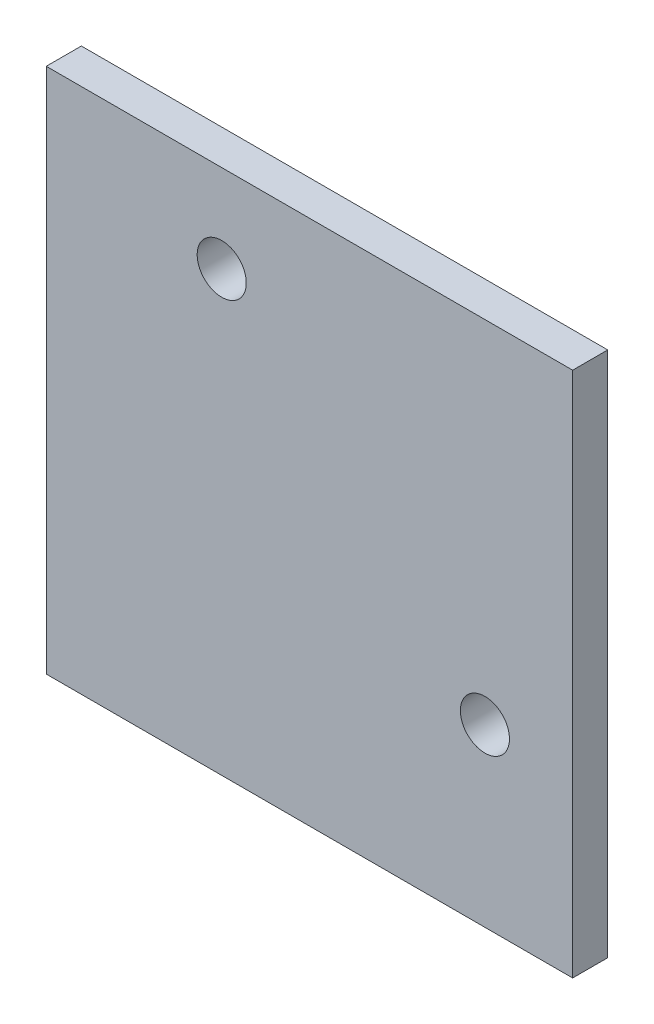
ISO-10303-21;
HEADER;
FILE_DESCRIPTION(('STEP AP214'),'2;1');
FILE_NAME('part.step','',(''),(''),'','','');
FILE_SCHEMA(('AUTOMOTIVE_DESIGN { 1 0 10303 214 1 1 1 1 }'));
ENDSEC;
DATA;
#1=APPLICATION_CONTEXT('core data for automotive mechanical design processes');
#2=APPLICATION_PROTOCOL_DEFINITION('international standard','automotive_design',2000,#1);
#3=PRODUCT_CONTEXT('',#1,'mechanical');
#4=PRODUCT('Part','Part','',(#3));
#5=PRODUCT_RELATED_PRODUCT_CATEGORY('part','',(#4));
#6=PRODUCT_DEFINITION_FORMATION('','',#4);
#7=PRODUCT_DEFINITION_CONTEXT('part definition',#1,'design');
#8=PRODUCT_DEFINITION('design','',#6,#7);
#9=PRODUCT_DEFINITION_SHAPE('','',#8);
#10=(LENGTH_UNIT() NAMED_UNIT(*) SI_UNIT(.MILLI.,.METRE.));
#11=(NAMED_UNIT(*) PLANE_ANGLE_UNIT() SI_UNIT($,.RADIAN.));
#12=(NAMED_UNIT(*) SI_UNIT($,.STERADIAN.) SOLID_ANGLE_UNIT());
#13=UNCERTAINTY_MEASURE_WITH_UNIT(LENGTH_MEASURE(1.E-05),#10,'distance_accuracy_value','');
#14=(GEOMETRIC_REPRESENTATION_CONTEXT(3) GLOBAL_UNCERTAINTY_ASSIGNED_CONTEXT((#13)) GLOBAL_UNIT_ASSIGNED_CONTEXT((#10,
#11,#12)) REPRESENTATION_CONTEXT('',''));
#15=CARTESIAN_POINT('',(0.,0.,0.));
#16=DIRECTION('',(0.,0.,1.));
#17=DIRECTION('',(1.,0.,0.));
#18=AXIS2_PLACEMENT_3D('',#15,#16,#17);
#19=CARTESIAN_POINT('',(0.,0.,-10.));
#20=DIRECTION('',(-1.,0.,0.));
#21=DIRECTION('',(0.,0.,1.));
#22=AXIS2_PLACEMENT_3D('',#19,#20,#21);
#23=PLANE('',#22);
#24=DIRECTION('',(0.,-1.,0.));
#25=VECTOR('',#24,1.);
#26=CARTESIAN_POINT('',(0.,0.,0.));
#27=LINE('',#26,#25);
#28=CARTESIAN_POINT('',(0.,0.,0.));
#29=VERTEX_POINT('',#28);
#30=CARTESIAN_POINT('',(0.,-150.,2.22044604925031E-13));
#31=VERTEX_POINT('',#30);
#32=EDGE_CURVE('E104',#29,#31,#27,.T.);
#33=ORIENTED_EDGE('',*,*,#32,.F.);
#34=DIRECTION('',(0.,0.,1.));
#35=VECTOR('',#34,1.);
#36=CARTESIAN_POINT('',(0.,0.,-10.));
#37=LINE('',#36,#35);
#38=CARTESIAN_POINT('',(0.,0.,-10.));
#39=VERTEX_POINT('',#38);
#40=EDGE_CURVE('E11',#39,#29,#37,.T.);
#41=ORIENTED_EDGE('',*,*,#40,.F.);
#42=DIRECTION('',(0.,-1.,0.));
#43=VECTOR('',#42,1.);
#44=CARTESIAN_POINT('',(0.,0.,-10.));
#45=LINE('',#44,#43);
#46=CARTESIAN_POINT('',(0.,-150.,-9.99999999999979));
#47=VERTEX_POINT('',#46);
#48=EDGE_CURVE('E97',#39,#47,#45,.T.);
#49=ORIENTED_EDGE('',*,*,#48,.T.);
#50=DIRECTION('',(0.,0.,1.));
#51=VECTOR('',#50,1.);
#52=CARTESIAN_POINT('',(0.,-150.,-9.99999999999979));
#53=LINE('',#52,#51);
#54=EDGE_CURVE('E42',#47,#31,#53,.T.);
#55=ORIENTED_EDGE('',*,*,#54,.T.);
#56=EDGE_LOOP('',(#33,#41,#49,#55));
#57=FACE_BOUND('',#56,.T.);
#58=ADVANCED_FACE('F39',(#57),#23,.T.);
#59=CARTESIAN_POINT('',(0.,0.,-10.));
#60=DIRECTION('',(0.,1.,0.));
#61=DIRECTION('',(-1.,0.,0.));
#62=AXIS2_PLACEMENT_3D('',#59,#60,#61);
#63=PLANE('',#62);
#64=DIRECTION('',(-1.,0.,0.));
#65=VECTOR('',#64,1.);
#66=CARTESIAN_POINT('',(0.,0.,0.));
#67=LINE('',#66,#65);
#68=CARTESIAN_POINT('',(150.,0.,0.));
#69=VERTEX_POINT('',#68);
#70=EDGE_CURVE('E99',#69,#29,#67,.T.);
#71=ORIENTED_EDGE('',*,*,#70,.F.);
#72=DIRECTION('',(0.,0.,1.));
#73=VECTOR('',#72,1.);
#74=CARTESIAN_POINT('',(150.,0.,-10.));
#75=LINE('',#74,#73);
#76=CARTESIAN_POINT('',(150.,0.,-10.));
#77=VERTEX_POINT('',#76);
#78=EDGE_CURVE('E48',#77,#69,#75,.T.);
#79=ORIENTED_EDGE('',*,*,#78,.F.);
#80=DIRECTION('',(-1.,0.,0.));
#81=VECTOR('',#80,1.);
#82=CARTESIAN_POINT('',(0.,0.,-10.));
#83=LINE('',#82,#81);
#84=EDGE_CURVE('E94',#77,#39,#83,.T.);
#85=ORIENTED_EDGE('',*,*,#84,.T.);
#86=ORIENTED_EDGE('',*,*,#40,.T.);
#87=EDGE_LOOP('',(#71,#79,#85,#86));
#88=FACE_BOUND('',#87,.T.);
#89=ADVANCED_FACE('F115',(#88),#63,.T.);
#90=CARTESIAN_POINT('',(150.,0.,-10.));
#91=DIRECTION('',(1.,0.,0.));
#92=DIRECTION('',(0.,0.,-1.));
#93=AXIS2_PLACEMENT_3D('',#90,#91,#92);
#94=PLANE('',#93);
#95=DIRECTION('',(0.,1.,0.));
#96=VECTOR('',#95,1.);
#97=CARTESIAN_POINT('',(150.,0.,0.));
#98=LINE('',#97,#96);
#99=CARTESIAN_POINT('',(150.,-150.,4.44089209850063E-13));
#100=VERTEX_POINT('',#99);
#101=EDGE_CURVE('E89',#100,#69,#98,.T.);
#102=ORIENTED_EDGE('',*,*,#101,.F.);
#103=DIRECTION('',(0.,0.,1.));
#104=VECTOR('',#103,1.);
#105=CARTESIAN_POINT('',(150.,-150.,-9.99999999999956));
#106=LINE('',#105,#104);
#107=CARTESIAN_POINT('',(150.,-150.,-9.99999999999956));
#108=VERTEX_POINT('',#107);
#109=EDGE_CURVE('E84',#108,#100,#106,.T.);
#110=ORIENTED_EDGE('',*,*,#109,.F.);
#111=DIRECTION('',(0.,1.,0.));
#112=VECTOR('',#111,1.);
#113=CARTESIAN_POINT('',(150.,0.,-10.));
#114=LINE('',#113,#112);
#115=EDGE_CURVE('E87',#108,#77,#114,.T.);
#116=ORIENTED_EDGE('',*,*,#115,.T.);
#117=ORIENTED_EDGE('',*,*,#78,.T.);
#118=EDGE_LOOP('',(#102,#110,#116,#117));
#119=FACE_BOUND('',#118,.T.);
#120=ADVANCED_FACE('F86',(#119),#94,.T.);
#121=CARTESIAN_POINT('',(0.,-150.,-9.99999999999979));
#122=DIRECTION('',(0.,-1.,0.));
#123=DIRECTION('',(0.,0.,-1.));
#124=AXIS2_PLACEMENT_3D('',#121,#122,#123);
#125=PLANE('',#124);
#126=DIRECTION('',(1.,0.,0.));
#127=VECTOR('',#126,1.);
#128=CARTESIAN_POINT('',(0.,-150.,2.22044604925031E-13));
#129=LINE('',#128,#127);
#130=EDGE_CURVE('E107',#31,#100,#129,.T.);
#131=ORIENTED_EDGE('',*,*,#130,.F.);
#132=ORIENTED_EDGE('',*,*,#54,.F.);
#133=DIRECTION('',(1.,0.,0.));
#134=VECTOR('',#133,1.);
#135=CARTESIAN_POINT('',(0.,-150.,-9.99999999999979));
#136=LINE('',#135,#134);
#137=EDGE_CURVE('E93',#47,#108,#136,.T.);
#138=ORIENTED_EDGE('',*,*,#137,.T.);
#139=ORIENTED_EDGE('',*,*,#109,.T.);
#140=EDGE_LOOP('',(#131,#132,#138,#139));
#141=FACE_BOUND('',#140,.T.);
#142=ADVANCED_FACE('F96',(#141),#125,.T.);
#143=CARTESIAN_POINT('',(0.,0.,-10.));
#144=DIRECTION('',(0.,0.,1.));
#145=DIRECTION('',(1.,0.,0.));
#146=AXIS2_PLACEMENT_3D('',#143,#144,#145);
#147=PLANE('',#146);
#148=CARTESIAN_POINT('',(125.,-99.9999999999997,-9.99999999999979));
#149=DIRECTION('',(0.,0.,-1.));
#150=DIRECTION('',(-1.,0.,0.));
#151=AXIS2_PLACEMENT_3D('',#148,#149,#150);
#152=CIRCLE('',#151,7.00000000000002);
#153=CARTESIAN_POINT('',(118.,-99.9999999999997,-9.99999999999979));
#154=VERTEX_POINT('',#153);
#155=EDGE_CURVE('E150',#154,#154,#152,.T.);
#156=ORIENTED_EDGE('',*,*,#155,.F.);
#157=EDGE_LOOP('',(#156));
#158=FACE_BOUND('',#157,.T.);
#159=CARTESIAN_POINT('',(50.,-25.0000000000004,-10.));
#160=DIRECTION('',(0.,0.,-1.));
#161=DIRECTION('',(-1.,0.,0.));
#162=AXIS2_PLACEMENT_3D('',#159,#160,#161);
#163=CIRCLE('',#162,7.);
#164=CARTESIAN_POINT('',(43.,-25.0000000000004,-10.));
#165=VERTEX_POINT('',#164);
#166=EDGE_CURVE('E155',#165,#165,#163,.T.);
#167=ORIENTED_EDGE('',*,*,#166,.F.);
#168=EDGE_LOOP('',(#167));
#169=FACE_BOUND('',#168,.T.);
#170=ORIENTED_EDGE('',*,*,#48,.F.);
#171=ORIENTED_EDGE('',*,*,#84,.F.);
#172=ORIENTED_EDGE('',*,*,#115,.F.);
#173=ORIENTED_EDGE('',*,*,#137,.F.);
#174=EDGE_LOOP('',(#170,#171,#172,#173));
#175=FACE_BOUND('',#174,.T.);
#176=ADVANCED_FACE('F92',(#158,#169,#175),#147,.F.);
#177=CARTESIAN_POINT('',(0.,0.,0.));
#178=DIRECTION('',(0.,0.,1.));
#179=DIRECTION('',(1.,0.,0.));
#180=AXIS2_PLACEMENT_3D('',#177,#178,#179);
#181=PLANE('',#180);
#182=CARTESIAN_POINT('',(125.,-99.9999999999997,2.22044604925031E-13));
#183=DIRECTION('',(0.,0.,-1.));
#184=DIRECTION('',(-1.,0.,0.));
#185=AXIS2_PLACEMENT_3D('',#182,#183,#184);
#186=CIRCLE('',#185,7.00000000000002);
#187=CARTESIAN_POINT('',(118.,-99.9999999999997,2.22588999519987E-13));
#188=VERTEX_POINT('',#187);
#189=EDGE_CURVE('E108',#188,#188,#186,.T.);
#190=ORIENTED_EDGE('',*,*,#189,.T.);
#191=EDGE_LOOP('',(#190));
#192=FACE_BOUND('',#191,.T.);
#193=CARTESIAN_POINT('',(50.0000000000003,-25.0000000000004,0.));
#194=DIRECTION('',(0.,0.,-1.));
#195=DIRECTION('',(-1.,0.,0.));
#196=AXIS2_PLACEMENT_3D('',#193,#194,#195);
#197=CIRCLE('',#196,7.);
#198=CARTESIAN_POINT('',(43.0000000000003,-25.0000000000004,0.));
#199=VERTEX_POINT('',#198);
#200=EDGE_CURVE('E151',#199,#199,#197,.T.);
#201=ORIENTED_EDGE('',*,*,#200,.T.);
#202=EDGE_LOOP('',(#201));
#203=FACE_BOUND('',#202,.T.);
#204=ORIENTED_EDGE('',*,*,#32,.T.);
#205=ORIENTED_EDGE('',*,*,#130,.T.);
#206=ORIENTED_EDGE('',*,*,#101,.T.);
#207=ORIENTED_EDGE('',*,*,#70,.T.);
#208=EDGE_LOOP('',(#204,#205,#206,#207));
#209=FACE_BOUND('',#208,.T.);
#210=ADVANCED_FACE('F114',(#192,#203,#209),#181,.T.);
#211=CARTESIAN_POINT('',(50.0000000000003,-25.0000000000004,0.));
#212=DIRECTION('',(0.,0.,-1.));
#213=DIRECTION('',(-1.,0.,0.));
#214=AXIS2_PLACEMENT_3D('',#211,#212,#213);
#215=CYLINDRICAL_SURFACE('',#214,7.);
#216=ORIENTED_EDGE('',*,*,#200,.F.);
#217=EDGE_LOOP('',(#216));
#218=FACE_BOUND('',#217,.T.);
#219=ORIENTED_EDGE('',*,*,#166,.T.);
#220=EDGE_LOOP('',(#219));
#221=FACE_BOUND('',#220,.T.);
#222=ADVANCED_FACE('F133',(#218,#221),#215,.F.);
#223=CARTESIAN_POINT('',(125.,-99.9999999999997,2.22044604925031E-13));
#224=DIRECTION('',(0.,0.,-1.));
#225=DIRECTION('',(-1.,0.,0.));
#226=AXIS2_PLACEMENT_3D('',#223,#224,#225);
#227=CYLINDRICAL_SURFACE('',#226,7.00000000000002);
#228=ORIENTED_EDGE('',*,*,#189,.F.);
#229=EDGE_LOOP('',(#228));
#230=FACE_BOUND('',#229,.T.);
#231=ORIENTED_EDGE('',*,*,#155,.T.);
#232=EDGE_LOOP('',(#231));
#233=FACE_BOUND('',#232,.T.);
#234=ADVANCED_FACE('F140',(#230,#233),#227,.F.);
#235=CLOSED_SHELL('',(#58,#89,#120,#142,#176,#210,#222,#234));
#236=MANIFOLD_SOLID_BREP('B2',#235);
#237=ADVANCED_BREP_SHAPE_REPRESENTATION('',(#18,#236),#14);
#238=SHAPE_DEFINITION_REPRESENTATION(#9,#237);
ENDSEC;
END-ISO-10303-21;
